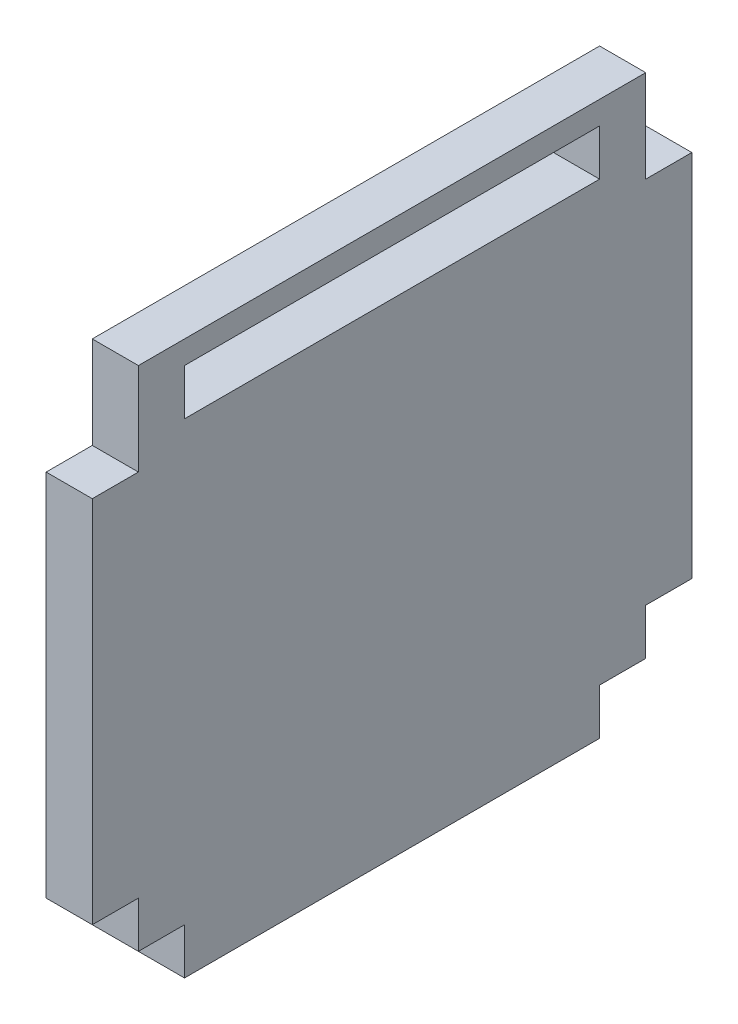
ISO-10303-21;
HEADER;
FILE_DESCRIPTION(('STEP AP214'),'2;1');
FILE_NAME('part.step','',(''),(''),'','','');
FILE_SCHEMA(('AUTOMOTIVE_DESIGN { 1 0 10303 214 1 1 1 1 }'));
ENDSEC;
DATA;
#1=APPLICATION_CONTEXT('core data for automotive mechanical design processes');
#2=APPLICATION_PROTOCOL_DEFINITION('international standard','automotive_design',2000,#1);
#3=PRODUCT_CONTEXT('',#1,'mechanical');
#4=PRODUCT('Part','Part','',(#3));
#5=PRODUCT_RELATED_PRODUCT_CATEGORY('part','',(#4));
#6=PRODUCT_DEFINITION_FORMATION('','',#4);
#7=PRODUCT_DEFINITION_CONTEXT('part definition',#1,'design');
#8=PRODUCT_DEFINITION('design','',#6,#7);
#9=PRODUCT_DEFINITION_SHAPE('','',#8);
#10=(LENGTH_UNIT() NAMED_UNIT(*) SI_UNIT(.MILLI.,.METRE.));
#11=(NAMED_UNIT(*) PLANE_ANGLE_UNIT() SI_UNIT($,.RADIAN.));
#12=(NAMED_UNIT(*) SI_UNIT($,.STERADIAN.) SOLID_ANGLE_UNIT());
#13=UNCERTAINTY_MEASURE_WITH_UNIT(LENGTH_MEASURE(1.E-05),#10,'distance_accuracy_value','');
#14=(GEOMETRIC_REPRESENTATION_CONTEXT(3) GLOBAL_UNCERTAINTY_ASSIGNED_CONTEXT((#13)) GLOBAL_UNIT_ASSIGNED_CONTEXT((#10,
#11,#12)) REPRESENTATION_CONTEXT('',''));
#15=CARTESIAN_POINT('',(0.,0.,0.));
#16=DIRECTION('',(0.,0.,1.));
#17=DIRECTION('',(1.,0.,0.));
#18=AXIS2_PLACEMENT_3D('',#15,#16,#17);
#19=CARTESIAN_POINT('',(12.7,38.1,76.2));
#20=DIRECTION('',(-1.,0.,0.));
#21=DIRECTION('',(0.,-1.,0.));
#22=AXIS2_PLACEMENT_3D('',#19,#20,#21);
#23=PLANE('',#22);
#24=DIRECTION('',(0.,0.,1.));
#25=VECTOR('',#24,1.);
#26=CARTESIAN_POINT('',(12.7,28.575,76.2));
#27=LINE('',#26,#25);
#28=CARTESIAN_POINT('',(12.7,28.575,6.34999999999999));
#29=VERTEX_POINT('',#28);
#30=CARTESIAN_POINT('',(12.7,28.575,63.5));
#31=VERTEX_POINT('',#30);
#32=EDGE_CURVE('E200',#29,#31,#27,.T.);
#33=ORIENTED_EDGE('',*,*,#32,.T.);
#34=DIRECTION('',(0.,1.,0.));
#35=VECTOR('',#34,1.);
#36=CARTESIAN_POINT('',(12.7,38.1,63.5));
#37=LINE('',#36,#35);
#38=CARTESIAN_POINT('',(12.7,34.925,63.5));
#39=VERTEX_POINT('',#38);
#40=EDGE_CURVE('E203',#31,#39,#37,.T.);
#41=ORIENTED_EDGE('',*,*,#40,.T.);
#42=DIRECTION('',(0.,0.,-1.));
#43=VECTOR('',#42,1.);
#44=CARTESIAN_POINT('',(12.7,34.925,76.2));
#45=LINE('',#44,#43);
#46=CARTESIAN_POINT('',(12.7,34.925,6.34999999999999));
#47=VERTEX_POINT('',#46);
#48=EDGE_CURVE('E195',#39,#47,#45,.T.);
#49=ORIENTED_EDGE('',*,*,#48,.T.);
#50=DIRECTION('',(0.,-1.,0.));
#51=VECTOR('',#50,1.);
#52=CARTESIAN_POINT('',(12.7,38.1,6.34999999999999));
#53=LINE('',#52,#51);
#54=EDGE_CURVE('E175',#47,#29,#53,.T.);
#55=ORIENTED_EDGE('',*,*,#54,.T.);
#56=EDGE_LOOP('',(#33,#41,#49,#55));
#57=FACE_BOUND('',#56,.T.);
#58=DIRECTION('',(0.,0.,-1.));
#59=VECTOR('',#58,1.);
#60=CARTESIAN_POINT('',(12.7,25.4,76.2));
#61=LINE('',#60,#59);
#62=CARTESIAN_POINT('',(12.7,25.4,76.2));
#63=VERTEX_POINT('',#62);
#64=CARTESIAN_POINT('',(12.7,25.4,69.85));
#65=VERTEX_POINT('',#64);
#66=EDGE_CURVE('E220',#63,#65,#61,.T.);
#67=ORIENTED_EDGE('',*,*,#66,.F.);
#68=DIRECTION('',(0.,1.,0.));
#69=VECTOR('',#68,1.);
#70=CARTESIAN_POINT('',(12.7,38.1,76.2));
#71=LINE('',#70,#69);
#72=CARTESIAN_POINT('',(12.7,-25.4,76.2));
#73=VERTEX_POINT('',#72);
#74=EDGE_CURVE('E308',#73,#63,#71,.T.);
#75=ORIENTED_EDGE('',*,*,#74,.F.);
#76=DIRECTION('',(0.,0.,1.));
#77=VECTOR('',#76,1.);
#78=CARTESIAN_POINT('',(12.7,-25.4,76.2));
#79=LINE('',#78,#77);
#80=CARTESIAN_POINT('',(12.7,-25.4,69.85));
#81=VERTEX_POINT('',#80);
#82=EDGE_CURVE('E253',#81,#73,#79,.T.);
#83=ORIENTED_EDGE('',*,*,#82,.F.);
#84=DIRECTION('',(0.,-1.,0.));
#85=VECTOR('',#84,1.);
#86=CARTESIAN_POINT('',(12.7,38.1,69.85));
#87=LINE('',#86,#85);
#88=CARTESIAN_POINT('',(12.7,-31.75,69.85));
#89=VERTEX_POINT('',#88);
#90=EDGE_CURVE('E262',#81,#89,#87,.T.);
#91=ORIENTED_EDGE('',*,*,#90,.T.);
#92=DIRECTION('',(0.,0.,-1.));
#93=VECTOR('',#92,1.);
#94=CARTESIAN_POINT('',(12.7,-31.75,76.2));
#95=LINE('',#94,#93);
#96=CARTESIAN_POINT('',(12.7,-31.75,63.5));
#97=VERTEX_POINT('',#96);
#98=EDGE_CURVE('E265',#89,#97,#95,.T.);
#99=ORIENTED_EDGE('',*,*,#98,.T.);
#100=DIRECTION('',(0.,1.,0.));
#101=VECTOR('',#100,1.);
#102=CARTESIAN_POINT('',(12.7,38.1,63.5));
#103=LINE('',#102,#101);
#104=CARTESIAN_POINT('',(12.7,-38.1,63.5));
#105=VERTEX_POINT('',#104);
#106=EDGE_CURVE('E260',#105,#97,#103,.T.);
#107=ORIENTED_EDGE('',*,*,#106,.F.);
#108=DIRECTION('',(0.,0.,-1.));
#109=VECTOR('',#108,1.);
#110=CARTESIAN_POINT('',(12.7,-38.1,76.2));
#111=LINE('',#110,#109);
#112=CARTESIAN_POINT('',(12.7,-38.1,6.35));
#113=VERTEX_POINT('',#112);
#114=EDGE_CURVE('E314',#105,#113,#111,.T.);
#115=ORIENTED_EDGE('',*,*,#114,.T.);
#116=DIRECTION('',(0.,1.,0.));
#117=VECTOR('',#116,1.);
#118=CARTESIAN_POINT('',(12.7,38.1,6.34999999999999));
#119=LINE('',#118,#117);
#120=CARTESIAN_POINT('',(12.7,-31.75,6.35));
#121=VERTEX_POINT('',#120);
#122=EDGE_CURVE('E234',#113,#121,#119,.T.);
#123=ORIENTED_EDGE('',*,*,#122,.T.);
#124=DIRECTION('',(0.,0.,1.));
#125=VECTOR('',#124,1.);
#126=CARTESIAN_POINT('',(12.7,-31.7500000000001,76.1999999999999));
#127=LINE('',#126,#125);
#128=CARTESIAN_POINT('',(12.7,-31.75,0.));
#129=VERTEX_POINT('',#128);
#130=EDGE_CURVE('E232',#129,#121,#127,.T.);
#131=ORIENTED_EDGE('',*,*,#130,.F.);
#132=DIRECTION('',(0.,1.,0.));
#133=VECTOR('',#132,1.);
#134=CARTESIAN_POINT('',(12.7,38.1,0.));
#135=LINE('',#134,#133);
#136=CARTESIAN_POINT('',(12.7,-25.4,0.));
#137=VERTEX_POINT('',#136);
#138=EDGE_CURVE('E322',#129,#137,#135,.T.);
#139=ORIENTED_EDGE('',*,*,#138,.T.);
#140=DIRECTION('',(0.,0.,-1.));
#141=VECTOR('',#140,1.);
#142=CARTESIAN_POINT('',(12.7,-25.4,0.));
#143=LINE('',#142,#141);
#144=CARTESIAN_POINT('',(12.7,-25.4,-6.35));
#145=VERTEX_POINT('',#144);
#146=EDGE_CURVE('E271',#137,#145,#143,.T.);
#147=ORIENTED_EDGE('',*,*,#146,.T.);
#148=DIRECTION('',(0.,1.,0.));
#149=VECTOR('',#148,1.);
#150=CARTESIAN_POINT('',(12.7,-25.4,-6.35));
#151=LINE('',#150,#149);
#152=CARTESIAN_POINT('',(12.7,25.4,-6.35));
#153=VERTEX_POINT('',#152);
#154=EDGE_CURVE('E269',#145,#153,#151,.T.);
#155=ORIENTED_EDGE('',*,*,#154,.T.);
#156=DIRECTION('',(0.,0.,1.));
#157=VECTOR('',#156,1.);
#158=CARTESIAN_POINT('',(12.7,25.4,0.));
#159=LINE('',#158,#157);
#160=CARTESIAN_POINT('',(12.7,25.4,0.));
#161=VERTEX_POINT('',#160);
#162=EDGE_CURVE('E294',#153,#161,#159,.T.);
#163=ORIENTED_EDGE('',*,*,#162,.T.);
#164=CARTESIAN_POINT('',(12.7,38.1,0.));
#165=VERTEX_POINT('',#164);
#166=EDGE_CURVE('E299',#161,#165,#135,.T.);
#167=ORIENTED_EDGE('',*,*,#166,.T.);
#168=DIRECTION('',(0.,0.,-1.));
#169=VECTOR('',#168,1.);
#170=CARTESIAN_POINT('',(12.7,38.1,76.2));
#171=LINE('',#170,#169);
#172=CARTESIAN_POINT('',(12.7,38.1,69.85));
#173=VERTEX_POINT('',#172);
#174=EDGE_CURVE('E330',#173,#165,#171,.T.);
#175=ORIENTED_EDGE('',*,*,#174,.F.);
#176=DIRECTION('',(0.,-1.,0.));
#177=VECTOR('',#176,1.);
#178=CARTESIAN_POINT('',(12.7,38.1,69.85));
#179=LINE('',#178,#177);
#180=EDGE_CURVE('E217',#173,#65,#179,.T.);
#181=ORIENTED_EDGE('',*,*,#180,.T.);
#182=EDGE_LOOP('',(#67,#75,#83,#91,#99,#107,#115,#123,#131,#139,#147,#155,#163,#167,#175,#181));
#183=FACE_BOUND('',#182,.T.);
#184=ADVANCED_FACE('F33',(#57,#183),#23,.F.);
#185=CARTESIAN_POINT('',(6.35000000000001,38.1,76.2));
#186=DIRECTION('',(1.,0.,0.));
#187=DIRECTION('',(0.,1.,0.));
#188=AXIS2_PLACEMENT_3D('',#185,#186,#187);
#189=PLANE('',#188);
#190=DIRECTION('',(0.,0.,-1.));
#191=VECTOR('',#190,1.);
#192=CARTESIAN_POINT('',(6.35000000000001,34.925,63.5));
#193=LINE('',#192,#191);
#194=CARTESIAN_POINT('',(6.35000000000001,34.925,63.5));
#195=VERTEX_POINT('',#194);
#196=CARTESIAN_POINT('',(6.35000000000001,34.925,6.34999999999999));
#197=VERTEX_POINT('',#196);
#198=EDGE_CURVE('E181',#195,#197,#193,.T.);
#199=ORIENTED_EDGE('',*,*,#198,.F.);
#200=DIRECTION('',(0.,1.,0.));
#201=VECTOR('',#200,1.);
#202=CARTESIAN_POINT('',(6.35000000000001,28.575,63.5));
#203=LINE('',#202,#201);
#204=CARTESIAN_POINT('',(6.35000000000001,28.575,63.5));
#205=VERTEX_POINT('',#204);
#206=EDGE_CURVE('E55',#205,#195,#203,.T.);
#207=ORIENTED_EDGE('',*,*,#206,.F.);
#208=DIRECTION('',(0.,0.,1.));
#209=VECTOR('',#208,1.);
#210=CARTESIAN_POINT('',(6.35000000000001,28.575,6.34999999999999));
#211=LINE('',#210,#209);
#212=CARTESIAN_POINT('',(6.35000000000001,28.575,6.34999999999999));
#213=VERTEX_POINT('',#212);
#214=EDGE_CURVE('E188',#213,#205,#211,.T.);
#215=ORIENTED_EDGE('',*,*,#214,.F.);
#216=DIRECTION('',(0.,-1.,0.));
#217=VECTOR('',#216,1.);
#218=CARTESIAN_POINT('',(6.35000000000001,34.925,6.34999999999999));
#219=LINE('',#218,#217);
#220=EDGE_CURVE('E172',#197,#213,#219,.T.);
#221=ORIENTED_EDGE('',*,*,#220,.F.);
#222=EDGE_LOOP('',(#199,#207,#215,#221));
#223=FACE_BOUND('',#222,.T.);
#224=DIRECTION('',(0.,0.,-1.));
#225=VECTOR('',#224,1.);
#226=CARTESIAN_POINT('',(6.35000000000001,25.4,76.2));
#227=LINE('',#226,#225);
#228=CARTESIAN_POINT('',(6.35000000000001,25.4,76.2));
#229=VERTEX_POINT('',#228);
#230=CARTESIAN_POINT('',(6.35000000000001,25.4,69.85));
#231=VERTEX_POINT('',#230);
#232=EDGE_CURVE('E209',#229,#231,#227,.T.);
#233=ORIENTED_EDGE('',*,*,#232,.T.);
#234=DIRECTION('',(0.,-1.,0.));
#235=VECTOR('',#234,1.);
#236=CARTESIAN_POINT('',(6.35000000000001,38.1,69.85));
#237=LINE('',#236,#235);
#238=CARTESIAN_POINT('',(6.35000000000001,38.1,69.85));
#239=VERTEX_POINT('',#238);
#240=EDGE_CURVE('E214',#239,#231,#237,.T.);
#241=ORIENTED_EDGE('',*,*,#240,.F.);
#242=DIRECTION('',(0.,0.,-1.));
#243=VECTOR('',#242,1.);
#244=CARTESIAN_POINT('',(6.35000000000001,38.1,76.2));
#245=LINE('',#244,#243);
#246=CARTESIAN_POINT('',(6.35000000000001,38.1,0.));
#247=VERTEX_POINT('',#246);
#248=EDGE_CURVE('E334',#239,#247,#245,.T.);
#249=ORIENTED_EDGE('',*,*,#248,.T.);
#250=DIRECTION('',(0.,-1.,0.));
#251=VECTOR('',#250,1.);
#252=CARTESIAN_POINT('',(6.35000000000001,38.1,0.));
#253=LINE('',#252,#251);
#254=CARTESIAN_POINT('',(6.35000000000001,25.4,0.));
#255=VERTEX_POINT('',#254);
#256=EDGE_CURVE('E312',#247,#255,#253,.T.);
#257=ORIENTED_EDGE('',*,*,#256,.T.);
#258=DIRECTION('',(0.,0.,-1.));
#259=VECTOR('',#258,1.);
#260=CARTESIAN_POINT('',(6.35000000000001,25.4,0.));
#261=LINE('',#260,#259);
#262=CARTESIAN_POINT('',(6.35000000000001,25.4,-6.35));
#263=VERTEX_POINT('',#262);
#264=EDGE_CURVE('E268',#255,#263,#261,.T.);
#265=ORIENTED_EDGE('',*,*,#264,.T.);
#266=DIRECTION('',(0.,-1.,0.));
#267=VECTOR('',#266,1.);
#268=CARTESIAN_POINT('',(6.35000000000001,-25.4,-6.35));
#269=LINE('',#268,#267);
#270=CARTESIAN_POINT('',(6.35000000000001,-25.4,-6.35));
#271=VERTEX_POINT('',#270);
#272=EDGE_CURVE('E273',#263,#271,#269,.T.);
#273=ORIENTED_EDGE('',*,*,#272,.T.);
#274=DIRECTION('',(0.,0.,1.));
#275=VECTOR('',#274,1.);
#276=CARTESIAN_POINT('',(6.35000000000001,-25.4,0.));
#277=LINE('',#276,#275);
#278=CARTESIAN_POINT('',(6.35000000000001,-25.4,0.));
#279=VERTEX_POINT('',#278);
#280=EDGE_CURVE('E276',#271,#279,#277,.T.);
#281=ORIENTED_EDGE('',*,*,#280,.T.);
#282=CARTESIAN_POINT('',(6.35000000000001,-31.75,0.));
#283=VERTEX_POINT('',#282);
#284=EDGE_CURVE('E285',#279,#283,#253,.T.);
#285=ORIENTED_EDGE('',*,*,#284,.T.);
#286=DIRECTION('',(0.,0.,1.));
#287=VECTOR('',#286,1.);
#288=CARTESIAN_POINT('',(6.35000000000001,-31.75,0.));
#289=LINE('',#288,#287);
#290=CARTESIAN_POINT('',(6.35000000000001,-31.75,6.35));
#291=VERTEX_POINT('',#290);
#292=EDGE_CURVE('E225',#283,#291,#289,.T.);
#293=ORIENTED_EDGE('',*,*,#292,.T.);
#294=DIRECTION('',(0.,1.,0.));
#295=VECTOR('',#294,1.);
#296=CARTESIAN_POINT('',(6.35000000000001,0.,6.35));
#297=LINE('',#296,#295);
#298=CARTESIAN_POINT('',(6.35000000000002,-38.1,6.35));
#299=VERTEX_POINT('',#298);
#300=EDGE_CURVE('E229',#299,#291,#297,.T.);
#301=ORIENTED_EDGE('',*,*,#300,.F.);
#302=DIRECTION('',(0.,0.,-1.));
#303=VECTOR('',#302,1.);
#304=CARTESIAN_POINT('',(6.35000000000002,-38.1,76.2));
#305=LINE('',#304,#303);
#306=CARTESIAN_POINT('',(6.35000000000002,-38.1,63.5));
#307=VERTEX_POINT('',#306);
#308=EDGE_CURVE('E339',#307,#299,#305,.T.);
#309=ORIENTED_EDGE('',*,*,#308,.F.);
#310=DIRECTION('',(0.,1.,0.));
#311=VECTOR('',#310,1.);
#312=CARTESIAN_POINT('',(6.35000000000001,0.,63.5));
#313=LINE('',#312,#311);
#314=CARTESIAN_POINT('',(6.35000000000001,-31.75,63.5));
#315=VERTEX_POINT('',#314);
#316=EDGE_CURVE('E246',#307,#315,#313,.T.);
#317=ORIENTED_EDGE('',*,*,#316,.T.);
#318=DIRECTION('',(0.,0.,-1.));
#319=VECTOR('',#318,1.);
#320=CARTESIAN_POINT('',(6.35000000000001,-31.75,0.));
#321=LINE('',#320,#319);
#322=CARTESIAN_POINT('',(6.35000000000001,-31.75,69.85));
#323=VERTEX_POINT('',#322);
#324=EDGE_CURVE('E243',#323,#315,#321,.T.);
#325=ORIENTED_EDGE('',*,*,#324,.F.);
#326=DIRECTION('',(0.,-1.,0.));
#327=VECTOR('',#326,1.);
#328=CARTESIAN_POINT('',(6.35000000000001,0.,69.85));
#329=LINE('',#328,#327);
#330=CARTESIAN_POINT('',(6.35000000000001,-25.4,69.85));
#331=VERTEX_POINT('',#330);
#332=EDGE_CURVE('E240',#331,#323,#329,.T.);
#333=ORIENTED_EDGE('',*,*,#332,.F.);
#334=DIRECTION('',(0.,0.,1.));
#335=VECTOR('',#334,1.);
#336=CARTESIAN_POINT('',(6.35000000000001,-25.4,0.));
#337=LINE('',#336,#335);
#338=CARTESIAN_POINT('',(6.35000000000001,-25.4,76.2));
#339=VERTEX_POINT('',#338);
#340=EDGE_CURVE('E237',#331,#339,#337,.T.);
#341=ORIENTED_EDGE('',*,*,#340,.T.);
#342=DIRECTION('',(0.,-1.,0.));
#343=VECTOR('',#342,1.);
#344=CARTESIAN_POINT('',(6.35000000000001,38.1,76.2));
#345=LINE('',#344,#343);
#346=EDGE_CURVE('E311',#229,#339,#345,.T.);
#347=ORIENTED_EDGE('',*,*,#346,.F.);
#348=EDGE_LOOP('',(#233,#241,#249,#257,#265,#273,#281,#285,#293,#301,#309,#317,#325,#333,#341,#347));
#349=FACE_BOUND('',#348,.T.);
#350=ADVANCED_FACE('F185',(#223,#349),#189,.F.);
#351=CARTESIAN_POINT('',(0.,0.,76.2));
#352=DIRECTION('',(0.,0.,-1.));
#353=DIRECTION('',(-1.,0.,0.));
#354=AXIS2_PLACEMENT_3D('',#351,#352,#353);
#355=PLANE('',#354);
#356=DIRECTION('',(-1.,0.,0.));
#357=VECTOR('',#356,1.);
#358=CARTESIAN_POINT('',(12.70005,25.4,76.2));
#359=LINE('',#358,#357);
#360=EDGE_CURVE('E206',#63,#229,#359,.T.);
#361=ORIENTED_EDGE('',*,*,#360,.T.);
#362=ORIENTED_EDGE('',*,*,#346,.T.);
#363=DIRECTION('',(-1.,0.,0.));
#364=VECTOR('',#363,1.);
#365=CARTESIAN_POINT('',(0.,-25.4,76.2));
#366=LINE('',#365,#364);
#367=EDGE_CURVE('E324',#73,#339,#366,.T.);
#368=ORIENTED_EDGE('',*,*,#367,.F.);
#369=ORIENTED_EDGE('',*,*,#74,.T.);
#370=EDGE_LOOP('',(#361,#362,#368,#369));
#371=FACE_BOUND('',#370,.T.);
#372=ADVANCED_FACE('F402',(#371),#355,.F.);
#373=CARTESIAN_POINT('',(0.,0.,0.));
#374=DIRECTION('',(0.,0.,-1.));
#375=DIRECTION('',(-1.,0.,0.));
#376=AXIS2_PLACEMENT_3D('',#373,#374,#375);
#377=PLANE('',#376);
#378=ORIENTED_EDGE('',*,*,#138,.F.);
#379=DIRECTION('',(-1.,0.,0.));
#380=VECTOR('',#379,1.);
#381=CARTESIAN_POINT('',(0.,-31.75,0.));
#382=LINE('',#381,#380);
#383=EDGE_CURVE('E40',#129,#283,#382,.T.);
#384=ORIENTED_EDGE('',*,*,#383,.T.);
#385=ORIENTED_EDGE('',*,*,#284,.F.);
#386=DIRECTION('',(-1.,0.,0.));
#387=VECTOR('',#386,1.);
#388=CARTESIAN_POINT('',(63.8953367016958,-25.4,0.));
#389=LINE('',#388,#387);
#390=EDGE_CURVE('E272',#137,#279,#389,.T.);
#391=ORIENTED_EDGE('',*,*,#390,.F.);
#392=EDGE_LOOP('',(#378,#384,#385,#391));
#393=FACE_BOUND('',#392,.T.);
#394=ADVANCED_FACE('F369',(#393),#377,.T.);
#395=CARTESIAN_POINT('',(12.7,-38.1,76.2));
#396=DIRECTION('',(0.,1.,0.));
#397=DIRECTION('',(0.,0.,1.));
#398=AXIS2_PLACEMENT_3D('',#395,#396,#397);
#399=PLANE('',#398);
#400=ORIENTED_EDGE('',*,*,#308,.T.);
#401=DIRECTION('',(-1.,0.,0.));
#402=VECTOR('',#401,1.);
#403=CARTESIAN_POINT('',(12.70005,-38.1,6.35));
#404=LINE('',#403,#402);
#405=EDGE_CURVE('E223',#113,#299,#404,.T.);
#406=ORIENTED_EDGE('',*,*,#405,.F.);
#407=ORIENTED_EDGE('',*,*,#114,.F.);
#408=DIRECTION('',(-1.,0.,0.));
#409=VECTOR('',#408,1.);
#410=CARTESIAN_POINT('',(12.70005,-38.1,63.5));
#411=LINE('',#410,#409);
#412=EDGE_CURVE('E250',#105,#307,#411,.T.);
#413=ORIENTED_EDGE('',*,*,#412,.T.);
#414=EDGE_LOOP('',(#400,#406,#407,#413));
#415=FACE_BOUND('',#414,.T.);
#416=ADVANCED_FACE('F383',(#415),#399,.F.);
#417=ORIENTED_EDGE('',*,*,#166,.F.);
#418=DIRECTION('',(-1.,0.,0.));
#419=VECTOR('',#418,1.);
#420=CARTESIAN_POINT('',(63.8953367016958,25.4,0.));
#421=LINE('',#420,#419);
#422=EDGE_CURVE('E290',#161,#255,#421,.T.);
#423=ORIENTED_EDGE('',*,*,#422,.T.);
#424=ORIENTED_EDGE('',*,*,#256,.F.);
#425=DIRECTION('',(-1.,0.,0.));
#426=VECTOR('',#425,1.);
#427=CARTESIAN_POINT('',(12.7,38.1,0.));
#428=LINE('',#427,#426);
#429=EDGE_CURVE('E317',#165,#247,#428,.T.);
#430=ORIENTED_EDGE('',*,*,#429,.F.);
#431=EDGE_LOOP('',(#417,#423,#424,#430));
#432=FACE_BOUND('',#431,.T.);
#433=ADVANCED_FACE('F355',(#432),#377,.T.);
#434=CARTESIAN_POINT('',(12.7,38.1,76.2));
#435=DIRECTION('',(0.,-1.,0.));
#436=DIRECTION('',(0.,0.,-1.));
#437=AXIS2_PLACEMENT_3D('',#434,#435,#436);
#438=PLANE('',#437);
#439=ORIENTED_EDGE('',*,*,#248,.F.);
#440=DIRECTION('',(1.,0.,0.));
#441=VECTOR('',#440,1.);
#442=CARTESIAN_POINT('',(12.7,38.1,69.85));
#443=LINE('',#442,#441);
#444=EDGE_CURVE('E11',#239,#173,#443,.T.);
#445=ORIENTED_EDGE('',*,*,#444,.T.);
#446=ORIENTED_EDGE('',*,*,#174,.T.);
#447=ORIENTED_EDGE('',*,*,#429,.T.);
#448=EDGE_LOOP('',(#439,#445,#446,#447));
#449=FACE_BOUND('',#448,.T.);
#450=ADVANCED_FACE('F353',(#449),#438,.F.);
#451=CARTESIAN_POINT('',(63.8953367016958,-25.4,0.));
#452=DIRECTION('',(0.,-1.,0.));
#453=DIRECTION('',(0.,0.,-1.));
#454=AXIS2_PLACEMENT_3D('',#451,#452,#453);
#455=PLANE('',#454);
#456=ORIENTED_EDGE('',*,*,#146,.F.);
#457=ORIENTED_EDGE('',*,*,#390,.T.);
#458=ORIENTED_EDGE('',*,*,#280,.F.);
#459=DIRECTION('',(-1.,0.,0.));
#460=VECTOR('',#459,1.);
#461=CARTESIAN_POINT('',(63.8953367016958,-25.4,-6.35));
#462=LINE('',#461,#460);
#463=EDGE_CURVE('E279',#145,#271,#462,.T.);
#464=ORIENTED_EDGE('',*,*,#463,.F.);
#465=EDGE_LOOP('',(#456,#457,#458,#464));
#466=FACE_BOUND('',#465,.T.);
#467=ADVANCED_FACE('F367',(#466),#455,.T.);
#468=CARTESIAN_POINT('',(63.8953367016958,-25.4,-6.35));
#469=DIRECTION('',(0.,0.,-1.));
#470=DIRECTION('',(-1.,0.,0.));
#471=AXIS2_PLACEMENT_3D('',#468,#469,#470);
#472=PLANE('',#471);
#473=ORIENTED_EDGE('',*,*,#154,.F.);
#474=ORIENTED_EDGE('',*,*,#463,.T.);
#475=ORIENTED_EDGE('',*,*,#272,.F.);
#476=DIRECTION('',(-1.,0.,0.));
#477=VECTOR('',#476,1.);
#478=CARTESIAN_POINT('',(63.8953367016958,25.4,-6.35));
#479=LINE('',#478,#477);
#480=EDGE_CURVE('E304',#153,#263,#479,.T.);
#481=ORIENTED_EDGE('',*,*,#480,.F.);
#482=EDGE_LOOP('',(#473,#474,#475,#481));
#483=FACE_BOUND('',#482,.T.);
#484=ADVANCED_FACE('F409',(#483),#472,.T.);
#485=CARTESIAN_POINT('',(63.8953367016958,25.4,0.));
#486=DIRECTION('',(0.,1.,0.));
#487=DIRECTION('',(-1.,0.,0.));
#488=AXIS2_PLACEMENT_3D('',#485,#486,#487);
#489=PLANE('',#488);
#490=ORIENTED_EDGE('',*,*,#162,.F.);
#491=ORIENTED_EDGE('',*,*,#480,.T.);
#492=ORIENTED_EDGE('',*,*,#264,.F.);
#493=ORIENTED_EDGE('',*,*,#422,.F.);
#494=EDGE_LOOP('',(#490,#491,#492,#493));
#495=FACE_BOUND('',#494,.T.);
#496=ADVANCED_FACE('F359',(#495),#489,.T.);
#497=CARTESIAN_POINT('',(12.70005,-31.75,0.));
#498=DIRECTION('',(0.,1.,0.));
#499=DIRECTION('',(-1.,0.,0.));
#500=AXIS2_PLACEMENT_3D('',#497,#498,#499);
#501=PLANE('',#500);
#502=DIRECTION('',(-1.,0.,0.));
#503=VECTOR('',#502,1.);
#504=CARTESIAN_POINT('',(12.70005,-31.75,69.85));
#505=LINE('',#504,#503);
#506=EDGE_CURVE('E256',#89,#323,#505,.T.);
#507=ORIENTED_EDGE('',*,*,#506,.T.);
#508=ORIENTED_EDGE('',*,*,#324,.T.);
#509=DIRECTION('',(-1.,0.,0.));
#510=VECTOR('',#509,1.);
#511=CARTESIAN_POINT('',(12.70005,-31.75,63.5));
#512=LINE('',#511,#510);
#513=EDGE_CURVE('E254',#97,#315,#512,.T.);
#514=ORIENTED_EDGE('',*,*,#513,.F.);
#515=ORIENTED_EDGE('',*,*,#98,.F.);
#516=EDGE_LOOP('',(#507,#508,#514,#515));
#517=FACE_BOUND('',#516,.T.);
#518=ADVANCED_FACE('F392',(#517),#501,.F.);
#519=CARTESIAN_POINT('',(12.70005,0.,69.85));
#520=DIRECTION('',(0.,0.,-1.));
#521=DIRECTION('',(-1.,0.,0.));
#522=AXIS2_PLACEMENT_3D('',#519,#520,#521);
#523=PLANE('',#522);
#524=DIRECTION('',(-1.,0.,0.));
#525=VECTOR('',#524,1.);
#526=CARTESIAN_POINT('',(12.70005,-25.4,69.85));
#527=LINE('',#526,#525);
#528=EDGE_CURVE('E249',#81,#331,#527,.T.);
#529=ORIENTED_EDGE('',*,*,#528,.T.);
#530=ORIENTED_EDGE('',*,*,#332,.T.);
#531=ORIENTED_EDGE('',*,*,#506,.F.);
#532=ORIENTED_EDGE('',*,*,#90,.F.);
#533=EDGE_LOOP('',(#529,#530,#531,#532));
#534=FACE_BOUND('',#533,.T.);
#535=ADVANCED_FACE('F394',(#534),#523,.F.);
#536=CARTESIAN_POINT('',(12.70005,0.,63.5));
#537=DIRECTION('',(0.,0.,1.));
#538=DIRECTION('',(1.,0.,0.));
#539=AXIS2_PLACEMENT_3D('',#536,#537,#538);
#540=PLANE('',#539);
#541=ORIENTED_EDGE('',*,*,#106,.T.);
#542=ORIENTED_EDGE('',*,*,#513,.T.);
#543=ORIENTED_EDGE('',*,*,#316,.F.);
#544=ORIENTED_EDGE('',*,*,#412,.F.);
#545=EDGE_LOOP('',(#541,#542,#543,#544));
#546=FACE_BOUND('',#545,.T.);
#547=ADVANCED_FACE('F387',(#546),#540,.T.);
#548=CARTESIAN_POINT('',(12.70005,-25.4,0.));
#549=DIRECTION('',(0.,-1.,0.));
#550=DIRECTION('',(1.,0.,0.));
#551=AXIS2_PLACEMENT_3D('',#548,#549,#550);
#552=PLANE('',#551);
#553=ORIENTED_EDGE('',*,*,#82,.T.);
#554=ORIENTED_EDGE('',*,*,#367,.T.);
#555=ORIENTED_EDGE('',*,*,#340,.F.);
#556=ORIENTED_EDGE('',*,*,#528,.F.);
#557=EDGE_LOOP('',(#553,#554,#555,#556));
#558=FACE_BOUND('',#557,.T.);
#559=ADVANCED_FACE('F399',(#558),#552,.T.);
#560=CARTESIAN_POINT('',(12.70005,0.,6.35));
#561=DIRECTION('',(0.,0.,1.));
#562=DIRECTION('',(1.,0.,0.));
#563=AXIS2_PLACEMENT_3D('',#560,#561,#562);
#564=PLANE('',#563);
#565=ORIENTED_EDGE('',*,*,#405,.T.);
#566=ORIENTED_EDGE('',*,*,#300,.T.);
#567=DIRECTION('',(-1.,0.,0.));
#568=VECTOR('',#567,1.);
#569=CARTESIAN_POINT('',(12.70005,-31.75,6.35));
#570=LINE('',#569,#568);
#571=EDGE_CURVE('E222',#121,#291,#570,.T.);
#572=ORIENTED_EDGE('',*,*,#571,.F.);
#573=ORIENTED_EDGE('',*,*,#122,.F.);
#574=EDGE_LOOP('',(#565,#566,#572,#573));
#575=FACE_BOUND('',#574,.T.);
#576=ADVANCED_FACE('F378',(#575),#564,.F.);
#577=CARTESIAN_POINT('',(12.70005,-31.75,0.));
#578=DIRECTION('',(0.,-1.,0.));
#579=DIRECTION('',(0.,0.,-1.));
#580=AXIS2_PLACEMENT_3D('',#577,#578,#579);
#581=PLANE('',#580);
#582=ORIENTED_EDGE('',*,*,#130,.T.);
#583=ORIENTED_EDGE('',*,*,#571,.T.);
#584=ORIENTED_EDGE('',*,*,#292,.F.);
#585=ORIENTED_EDGE('',*,*,#383,.F.);
#586=EDGE_LOOP('',(#582,#583,#584,#585));
#587=FACE_BOUND('',#586,.T.);
#588=ADVANCED_FACE('F376',(#587),#581,.T.);
#589=CARTESIAN_POINT('',(12.70005,25.4,76.2));
#590=DIRECTION('',(0.,1.,0.));
#591=DIRECTION('',(0.,0.,1.));
#592=AXIS2_PLACEMENT_3D('',#589,#590,#591);
#593=PLANE('',#592);
#594=ORIENTED_EDGE('',*,*,#66,.T.);
#595=DIRECTION('',(-1.,0.,0.));
#596=VECTOR('',#595,1.);
#597=CARTESIAN_POINT('',(12.70005,25.4,69.85));
#598=LINE('',#597,#596);
#599=EDGE_CURVE('E207',#65,#231,#598,.T.);
#600=ORIENTED_EDGE('',*,*,#599,.T.);
#601=ORIENTED_EDGE('',*,*,#232,.F.);
#602=ORIENTED_EDGE('',*,*,#360,.F.);
#603=EDGE_LOOP('',(#594,#600,#601,#602));
#604=FACE_BOUND('',#603,.T.);
#605=ADVANCED_FACE('F404',(#604),#593,.T.);
#606=CARTESIAN_POINT('',(12.70005,38.1,69.85));
#607=DIRECTION('',(0.,0.,-1.));
#608=DIRECTION('',(0.,1.,0.));
#609=AXIS2_PLACEMENT_3D('',#606,#607,#608);
#610=PLANE('',#609);
#611=ORIENTED_EDGE('',*,*,#444,.F.);
#612=ORIENTED_EDGE('',*,*,#240,.T.);
#613=ORIENTED_EDGE('',*,*,#599,.F.);
#614=ORIENTED_EDGE('',*,*,#180,.F.);
#615=EDGE_LOOP('',(#611,#612,#613,#614));
#616=FACE_BOUND('',#615,.T.);
#617=ADVANCED_FACE('F408',(#616),#610,.F.);
#618=CARTESIAN_POINT('',(12.70005,28.575,63.5));
#619=DIRECTION('',(0.,0.,1.));
#620=DIRECTION('',(1.,0.,0.));
#621=AXIS2_PLACEMENT_3D('',#618,#619,#620);
#622=PLANE('',#621);
#623=DIRECTION('',(-1.,0.,0.));
#624=VECTOR('',#623,1.);
#625=CARTESIAN_POINT('',(12.70005,28.575,63.5));
#626=LINE('',#625,#624);
#627=EDGE_CURVE('E193',#31,#205,#626,.T.);
#628=ORIENTED_EDGE('',*,*,#627,.T.);
#629=ORIENTED_EDGE('',*,*,#206,.T.);
#630=DIRECTION('',(-1.,0.,0.));
#631=VECTOR('',#630,1.);
#632=CARTESIAN_POINT('',(12.70005,34.925,63.5));
#633=LINE('',#632,#631);
#634=EDGE_CURVE('E178',#39,#195,#633,.T.);
#635=ORIENTED_EDGE('',*,*,#634,.F.);
#636=ORIENTED_EDGE('',*,*,#40,.F.);
#637=EDGE_LOOP('',(#628,#629,#635,#636));
#638=FACE_BOUND('',#637,.T.);
#639=ADVANCED_FACE('F427',(#638),#622,.F.);
#640=CARTESIAN_POINT('',(12.70005,28.575,6.34999999999999));
#641=DIRECTION('',(0.,-1.,0.));
#642=DIRECTION('',(1.,0.,0.));
#643=AXIS2_PLACEMENT_3D('',#640,#641,#642);
#644=PLANE('',#643);
#645=DIRECTION('',(-1.,0.,0.));
#646=VECTOR('',#645,1.);
#647=CARTESIAN_POINT('',(12.70005,28.575,6.34999999999999));
#648=LINE('',#647,#646);
#649=EDGE_CURVE('E177',#29,#213,#648,.T.);
#650=ORIENTED_EDGE('',*,*,#649,.T.);
#651=ORIENTED_EDGE('',*,*,#214,.T.);
#652=ORIENTED_EDGE('',*,*,#627,.F.);
#653=ORIENTED_EDGE('',*,*,#32,.F.);
#654=EDGE_LOOP('',(#650,#651,#652,#653));
#655=FACE_BOUND('',#654,.T.);
#656=ADVANCED_FACE('F426',(#655),#644,.F.);
#657=CARTESIAN_POINT('',(12.70005,34.925,6.34999999999999));
#658=DIRECTION('',(0.,0.,-1.));
#659=DIRECTION('',(-1.,0.,0.));
#660=AXIS2_PLACEMENT_3D('',#657,#658,#659);
#661=PLANE('',#660);
#662=DIRECTION('',(-1.,0.,0.));
#663=VECTOR('',#662,1.);
#664=CARTESIAN_POINT('',(12.70005,34.925,6.34999999999999));
#665=LINE('',#664,#663);
#666=EDGE_CURVE('E47',#47,#197,#665,.T.);
#667=ORIENTED_EDGE('',*,*,#666,.T.);
#668=ORIENTED_EDGE('',*,*,#220,.T.);
#669=ORIENTED_EDGE('',*,*,#649,.F.);
#670=ORIENTED_EDGE('',*,*,#54,.F.);
#671=EDGE_LOOP('',(#667,#668,#669,#670));
#672=FACE_BOUND('',#671,.T.);
#673=ADVANCED_FACE('F169',(#672),#661,.F.);
#674=CARTESIAN_POINT('',(12.70005,34.925,63.5));
#675=DIRECTION('',(0.,1.,0.));
#676=DIRECTION('',(-1.,0.,0.));
#677=AXIS2_PLACEMENT_3D('',#674,#675,#676);
#678=PLANE('',#677);
#679=ORIENTED_EDGE('',*,*,#634,.T.);
#680=ORIENTED_EDGE('',*,*,#198,.T.);
#681=ORIENTED_EDGE('',*,*,#666,.F.);
#682=ORIENTED_EDGE('',*,*,#48,.F.);
#683=EDGE_LOOP('',(#679,#680,#681,#682));
#684=FACE_BOUND('',#683,.T.);
#685=ADVANCED_FACE('F182',(#684),#678,.F.);
#686=CLOSED_SHELL('',(#184,#350,#372,#394,#416,#433,#450,#467,#484,#496,#518,#535,#547,#559,
#576,#588,#605,#617,#639,#656,#673,#685));
#687=MANIFOLD_SOLID_BREP('B2',#686);
#688=ADVANCED_BREP_SHAPE_REPRESENTATION('',(#18,#687),#14);
#689=SHAPE_DEFINITION_REPRESENTATION(#9,#688);
ENDSEC;
END-ISO-10303-21;
